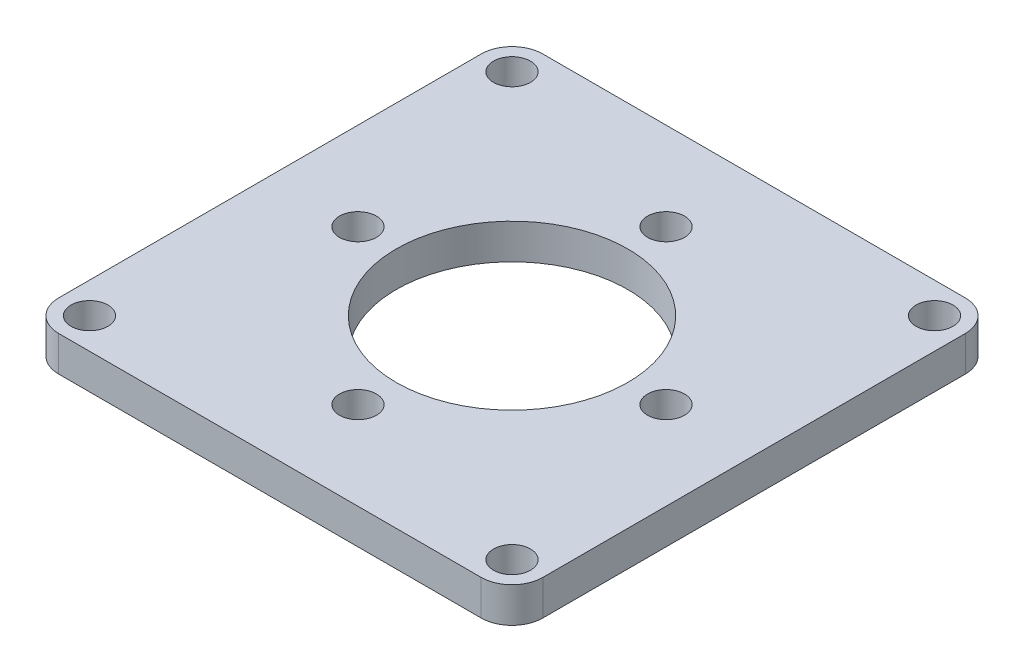
ISO-10303-21;
HEADER;
FILE_DESCRIPTION(('STEP AP214'),'2;1');
FILE_NAME('part.step','',(''),(''),'','','');
FILE_SCHEMA(('AUTOMOTIVE_DESIGN { 1 0 10303 214 1 1 1 1 }'));
ENDSEC;
DATA;
#1=APPLICATION_CONTEXT('core data for automotive mechanical design processes');
#2=APPLICATION_PROTOCOL_DEFINITION('international standard','automotive_design',2000,#1);
#3=PRODUCT_CONTEXT('',#1,'mechanical');
#4=PRODUCT('Part','Part','',(#3));
#5=PRODUCT_RELATED_PRODUCT_CATEGORY('part','',(#4));
#6=PRODUCT_DEFINITION_FORMATION('','',#4);
#7=PRODUCT_DEFINITION_CONTEXT('part definition',#1,'design');
#8=PRODUCT_DEFINITION('design','',#6,#7);
#9=PRODUCT_DEFINITION_SHAPE('','',#8);
#10=(LENGTH_UNIT() NAMED_UNIT(*) SI_UNIT(.MILLI.,.METRE.));
#11=(NAMED_UNIT(*) PLANE_ANGLE_UNIT() SI_UNIT($,.RADIAN.));
#12=(NAMED_UNIT(*) SI_UNIT($,.STERADIAN.) SOLID_ANGLE_UNIT());
#13=UNCERTAINTY_MEASURE_WITH_UNIT(LENGTH_MEASURE(1.E-05),#10,'distance_accuracy_value','');
#14=(GEOMETRIC_REPRESENTATION_CONTEXT(3) GLOBAL_UNCERTAINTY_ASSIGNED_CONTEXT((#13)) GLOBAL_UNIT_ASSIGNED_CONTEXT((#10,
#11,#12)) REPRESENTATION_CONTEXT('',''));
#15=CARTESIAN_POINT('',(0.,0.,0.));
#16=DIRECTION('',(0.,0.,1.));
#17=DIRECTION('',(1.,0.,0.));
#18=AXIS2_PLACEMENT_3D('',#15,#16,#17);
#19=CARTESIAN_POINT('',(27.5,4.,27.5));
#20=DIRECTION('',(-1.,0.,0.));
#21=DIRECTION('',(0.,0.,1.));
#22=AXIS2_PLACEMENT_3D('',#19,#20,#21);
#23=PLANE('',#22);
#24=DIRECTION('',(0.,0.,-1.));
#25=VECTOR('',#24,1.);
#26=CARTESIAN_POINT('',(27.5,0.,27.5));
#27=LINE('',#26,#25);
#28=CARTESIAN_POINT('',(27.5,0.,24.));
#29=VERTEX_POINT('',#28);
#30=CARTESIAN_POINT('',(27.5,0.,-24.));
#31=VERTEX_POINT('',#30);
#32=EDGE_CURVE('E129',#29,#31,#27,.T.);
#33=ORIENTED_EDGE('',*,*,#32,.T.);
#34=DIRECTION('',(0.,-1.,0.));
#35=VECTOR('',#34,1.);
#36=CARTESIAN_POINT('',(27.5,4.,-24.));
#37=LINE('',#36,#35);
#38=CARTESIAN_POINT('',(27.5,4.,-24.));
#39=VERTEX_POINT('',#38);
#40=EDGE_CURVE('E152',#31,#39,#37,.F.);
#41=ORIENTED_EDGE('',*,*,#40,.T.);
#42=DIRECTION('',(0.,0.,-1.));
#43=VECTOR('',#42,1.);
#44=CARTESIAN_POINT('',(27.5,4.,27.5));
#45=LINE('',#44,#43);
#46=CARTESIAN_POINT('',(27.5,4.,24.));
#47=VERTEX_POINT('',#46);
#48=EDGE_CURVE('E127',#47,#39,#45,.T.);
#49=ORIENTED_EDGE('',*,*,#48,.F.);
#50=DIRECTION('',(0.,-1.,0.));
#51=VECTOR('',#50,1.);
#52=CARTESIAN_POINT('',(27.5,4.,24.));
#53=LINE('',#52,#51);
#54=EDGE_CURVE('E149',#47,#29,#53,.T.);
#55=ORIENTED_EDGE('',*,*,#54,.T.);
#56=EDGE_LOOP('',(#33,#41,#49,#55));
#57=FACE_BOUND('',#56,.T.);
#58=ADVANCED_FACE('F34',(#57),#23,.F.);
#59=CARTESIAN_POINT('',(-27.5,4.,-27.5));
#60=DIRECTION('',(0.,0.,1.));
#61=DIRECTION('',(1.,0.,0.));
#62=AXIS2_PLACEMENT_3D('',#59,#60,#61);
#63=PLANE('',#62);
#64=DIRECTION('',(-1.,0.,0.));
#65=VECTOR('',#64,1.);
#66=CARTESIAN_POINT('',(-27.5,0.,-27.5));
#67=LINE('',#66,#65);
#68=CARTESIAN_POINT('',(24.,0.,-27.5));
#69=VERTEX_POINT('',#68);
#70=CARTESIAN_POINT('',(-24.,0.,-27.5));
#71=VERTEX_POINT('',#70);
#72=EDGE_CURVE('E125',#69,#71,#67,.T.);
#73=ORIENTED_EDGE('',*,*,#72,.T.);
#74=DIRECTION('',(0.,-1.,0.));
#75=VECTOR('',#74,1.);
#76=CARTESIAN_POINT('',(-24.,4.,-27.5));
#77=LINE('',#76,#75);
#78=CARTESIAN_POINT('',(-24.,4.,-27.5));
#79=VERTEX_POINT('',#78);
#80=EDGE_CURVE('E104',#71,#79,#77,.F.);
#81=ORIENTED_EDGE('',*,*,#80,.T.);
#82=DIRECTION('',(-1.,0.,0.));
#83=VECTOR('',#82,1.);
#84=CARTESIAN_POINT('',(-27.5,4.,-27.5));
#85=LINE('',#84,#83);
#86=CARTESIAN_POINT('',(24.,4.,-27.5));
#87=VERTEX_POINT('',#86);
#88=EDGE_CURVE('E168',#87,#79,#85,.T.);
#89=ORIENTED_EDGE('',*,*,#88,.F.);
#90=DIRECTION('',(0.,-1.,0.));
#91=VECTOR('',#90,1.);
#92=CARTESIAN_POINT('',(24.,4.,-27.5));
#93=LINE('',#92,#91);
#94=EDGE_CURVE('E109',#87,#69,#93,.T.);
#95=ORIENTED_EDGE('',*,*,#94,.T.);
#96=EDGE_LOOP('',(#73,#81,#89,#95));
#97=FACE_BOUND('',#96,.T.);
#98=ADVANCED_FACE('F263',(#97),#63,.F.);
#99=CARTESIAN_POINT('',(-27.5,4.,27.5));
#100=DIRECTION('',(1.,0.,0.));
#101=DIRECTION('',(0.,0.,-1.));
#102=AXIS2_PLACEMENT_3D('',#99,#100,#101);
#103=PLANE('',#102);
#104=DIRECTION('',(0.,0.,1.));
#105=VECTOR('',#104,1.);
#106=CARTESIAN_POINT('',(-27.5,4.,27.5));
#107=LINE('',#106,#105);
#108=CARTESIAN_POINT('',(-27.5,4.,-24.));
#109=VERTEX_POINT('',#108);
#110=CARTESIAN_POINT('',(-27.5,4.,24.));
#111=VERTEX_POINT('',#110);
#112=EDGE_CURVE('E118',#109,#111,#107,.T.);
#113=ORIENTED_EDGE('',*,*,#112,.F.);
#114=DIRECTION('',(0.,-1.,0.));
#115=VECTOR('',#114,1.);
#116=CARTESIAN_POINT('',(-27.5,4.,-24.));
#117=LINE('',#116,#115);
#118=CARTESIAN_POINT('',(-27.5,0.,-24.));
#119=VERTEX_POINT('',#118);
#120=EDGE_CURVE('E103',#109,#119,#117,.T.);
#121=ORIENTED_EDGE('',*,*,#120,.T.);
#122=DIRECTION('',(0.,0.,1.));
#123=VECTOR('',#122,1.);
#124=CARTESIAN_POINT('',(-27.5,0.,27.5));
#125=LINE('',#124,#123);
#126=CARTESIAN_POINT('',(-27.5,0.,24.));
#127=VERTEX_POINT('',#126);
#128=EDGE_CURVE('E116',#119,#127,#125,.T.);
#129=ORIENTED_EDGE('',*,*,#128,.T.);
#130=DIRECTION('',(0.,-1.,0.));
#131=VECTOR('',#130,1.);
#132=CARTESIAN_POINT('',(-27.5,4.,24.));
#133=LINE('',#132,#131);
#134=EDGE_CURVE('E120',#127,#111,#133,.F.);
#135=ORIENTED_EDGE('',*,*,#134,.T.);
#136=EDGE_LOOP('',(#113,#121,#129,#135));
#137=FACE_BOUND('',#136,.T.);
#138=ADVANCED_FACE('F115',(#137),#103,.F.);
#139=CARTESIAN_POINT('',(-27.5,4.,27.5));
#140=DIRECTION('',(0.,0.,-1.));
#141=DIRECTION('',(-1.,0.,0.));
#142=AXIS2_PLACEMENT_3D('',#139,#140,#141);
#143=PLANE('',#142);
#144=DIRECTION('',(1.,0.,0.));
#145=VECTOR('',#144,1.);
#146=CARTESIAN_POINT('',(-27.5,0.,27.5));
#147=LINE('',#146,#145);
#148=CARTESIAN_POINT('',(-24.,0.,27.5));
#149=VERTEX_POINT('',#148);
#150=CARTESIAN_POINT('',(24.,0.,27.5));
#151=VERTEX_POINT('',#150);
#152=EDGE_CURVE('E124',#149,#151,#147,.T.);
#153=ORIENTED_EDGE('',*,*,#152,.T.);
#154=DIRECTION('',(0.,-1.,0.));
#155=VECTOR('',#154,1.);
#156=CARTESIAN_POINT('',(24.,4.,27.5));
#157=LINE('',#156,#155);
#158=CARTESIAN_POINT('',(24.,4.,27.5));
#159=VERTEX_POINT('',#158);
#160=EDGE_CURVE('E11',#151,#159,#157,.F.);
#161=ORIENTED_EDGE('',*,*,#160,.T.);
#162=DIRECTION('',(1.,0.,0.));
#163=VECTOR('',#162,1.);
#164=CARTESIAN_POINT('',(-27.5,4.,27.5));
#165=LINE('',#164,#163);
#166=CARTESIAN_POINT('',(-24.,4.,27.5));
#167=VERTEX_POINT('',#166);
#168=EDGE_CURVE('E133',#167,#159,#165,.T.);
#169=ORIENTED_EDGE('',*,*,#168,.F.);
#170=DIRECTION('',(0.,-1.,0.));
#171=VECTOR('',#170,1.);
#172=CARTESIAN_POINT('',(-24.,4.,27.5));
#173=LINE('',#172,#171);
#174=EDGE_CURVE('E42',#167,#149,#173,.T.);
#175=ORIENTED_EDGE('',*,*,#174,.T.);
#176=EDGE_LOOP('',(#153,#161,#169,#175));
#177=FACE_BOUND('',#176,.T.);
#178=ADVANCED_FACE('F155',(#177),#143,.F.);
#179=CARTESIAN_POINT('',(0.,4.,0.));
#180=DIRECTION('',(0.,-1.,0.));
#181=DIRECTION('',(0.,0.,-1.));
#182=AXIS2_PLACEMENT_3D('',#179,#180,#181);
#183=PLANE('',#182);
#184=CARTESIAN_POINT('',(-23.9999999999999,4.,24.0000000000001));
#185=DIRECTION('',(0.,1.,0.));
#186=DIRECTION('',(1.,0.,0.));
#187=AXIS2_PLACEMENT_3D('',#184,#185,#186);
#188=CIRCLE('',#187,2.1);
#189=CARTESIAN_POINT('',(-21.8999999999999,4.,24.0000000000001));
#190=VERTEX_POINT('',#189);
#191=EDGE_CURVE('E226',#190,#190,#188,.T.);
#192=ORIENTED_EDGE('',*,*,#191,.F.);
#193=EDGE_LOOP('',(#192));
#194=FACE_BOUND('',#193,.T.);
#195=CARTESIAN_POINT('',(24.,4.,24.));
#196=DIRECTION('',(0.,1.,0.));
#197=DIRECTION('',(0.,0.,-1.));
#198=AXIS2_PLACEMENT_3D('',#195,#196,#197);
#199=CIRCLE('',#198,2.1);
#200=CARTESIAN_POINT('',(24.,4.,21.9));
#201=VERTEX_POINT('',#200);
#202=EDGE_CURVE('E220',#201,#201,#199,.T.);
#203=ORIENTED_EDGE('',*,*,#202,.F.);
#204=EDGE_LOOP('',(#203));
#205=FACE_BOUND('',#204,.T.);
#206=CARTESIAN_POINT('',(23.9999999999998,4.,-24.0000000000003));
#207=DIRECTION('',(0.,1.,0.));
#208=DIRECTION('',(-1.,0.,0.));
#209=AXIS2_PLACEMENT_3D('',#206,#207,#208);
#210=CIRCLE('',#209,2.1);
#211=CARTESIAN_POINT('',(21.8999999999998,4.,-24.0000000000002));
#212=VERTEX_POINT('',#211);
#213=EDGE_CURVE('E214',#212,#212,#210,.T.);
#214=ORIENTED_EDGE('',*,*,#213,.F.);
#215=EDGE_LOOP('',(#214));
#216=FACE_BOUND('',#215,.T.);
#217=CARTESIAN_POINT('',(-24.,4.,-24.));
#218=DIRECTION('',(0.,1.,0.));
#219=DIRECTION('',(0.,0.,1.));
#220=AXIS2_PLACEMENT_3D('',#217,#218,#219);
#221=CIRCLE('',#220,2.1);
#222=CARTESIAN_POINT('',(-24.,4.,-21.9));
#223=VERTEX_POINT('',#222);
#224=EDGE_CURVE('E208',#223,#223,#221,.T.);
#225=ORIENTED_EDGE('',*,*,#224,.F.);
#226=EDGE_LOOP('',(#225));
#227=FACE_BOUND('',#226,.T.);
#228=CARTESIAN_POINT('',(17.5,4.,1.2220184685951E-13));
#229=DIRECTION('',(0.,1.,0.));
#230=DIRECTION('',(-1.,0.,0.));
#231=AXIS2_PLACEMENT_3D('',#228,#229,#230);
#232=CIRCLE('',#231,2.1);
#233=CARTESIAN_POINT('',(15.4,4.,1.14869736047939E-13));
#234=VERTEX_POINT('',#233);
#235=EDGE_CURVE('E203',#234,#234,#232,.T.);
#236=ORIENTED_EDGE('',*,*,#235,.F.);
#237=EDGE_LOOP('',(#236));
#238=FACE_BOUND('',#237,.T.);
#239=CARTESIAN_POINT('',(0.,4.,17.5));
#240=DIRECTION('',(0.,1.,0.));
#241=DIRECTION('',(0.,0.,-1.));
#242=AXIS2_PLACEMENT_3D('',#239,#240,#241);
#243=CIRCLE('',#242,2.1);
#244=CARTESIAN_POINT('',(0.,4.,15.4));
#245=VERTEX_POINT('',#244);
#246=EDGE_CURVE('E197',#245,#245,#243,.T.);
#247=ORIENTED_EDGE('',*,*,#246,.F.);
#248=EDGE_LOOP('',(#247));
#249=FACE_BOUND('',#248,.T.);
#250=CARTESIAN_POINT('',(-17.5,4.,-2.44403693719019E-13));
#251=DIRECTION('',(0.,1.,0.));
#252=DIRECTION('',(1.,0.,0.));
#253=AXIS2_PLACEMENT_3D('',#250,#251,#252);
#254=CIRCLE('',#253,2.1);
#255=CARTESIAN_POINT('',(-15.4,4.,-2.22407361284308E-13));
#256=VERTEX_POINT('',#255);
#257=EDGE_CURVE('E190',#256,#256,#254,.T.);
#258=ORIENTED_EDGE('',*,*,#257,.F.);
#259=EDGE_LOOP('',(#258));
#260=FACE_BOUND('',#259,.T.);
#261=CARTESIAN_POINT('',(0.,4.,-17.5));
#262=DIRECTION('',(0.,1.,0.));
#263=DIRECTION('',(0.,0.,1.));
#264=AXIS2_PLACEMENT_3D('',#261,#262,#263);
#265=CIRCLE('',#264,2.1);
#266=CARTESIAN_POINT('',(0.,4.,-15.4));
#267=VERTEX_POINT('',#266);
#268=EDGE_CURVE('E184',#267,#267,#265,.T.);
#269=ORIENTED_EDGE('',*,*,#268,.F.);
#270=EDGE_LOOP('',(#269));
#271=FACE_BOUND('',#270,.T.);
#272=CARTESIAN_POINT('',(0.,4.,0.));
#273=DIRECTION('',(0.,1.,0.));
#274=DIRECTION('',(0.,0.,1.));
#275=AXIS2_PLACEMENT_3D('',#272,#273,#274);
#276=CIRCLE('',#275,13.15);
#277=CARTESIAN_POINT('',(0.,4.,13.15));
#278=VERTEX_POINT('',#277);
#279=EDGE_CURVE('E173',#278,#278,#276,.T.);
#280=ORIENTED_EDGE('',*,*,#279,.F.);
#281=EDGE_LOOP('',(#280));
#282=FACE_BOUND('',#281,.T.);
#283=ORIENTED_EDGE('',*,*,#88,.T.);
#284=CARTESIAN_POINT('',(-24.,4.,-24.));
#285=DIRECTION('',(0.,-1.,0.));
#286=DIRECTION('',(0.,0.,-1.));
#287=AXIS2_PLACEMENT_3D('',#284,#285,#286);
#288=CIRCLE('',#287,3.5);
#289=EDGE_CURVE('E147',#79,#109,#288,.F.);
#290=ORIENTED_EDGE('',*,*,#289,.T.);
#291=ORIENTED_EDGE('',*,*,#112,.T.);
#292=CARTESIAN_POINT('',(-24.,4.,24.));
#293=DIRECTION('',(0.,-1.,0.));
#294=DIRECTION('',(0.,0.,-1.));
#295=AXIS2_PLACEMENT_3D('',#292,#293,#294);
#296=CIRCLE('',#295,3.5);
#297=EDGE_CURVE('E54',#111,#167,#296,.F.);
#298=ORIENTED_EDGE('',*,*,#297,.T.);
#299=ORIENTED_EDGE('',*,*,#168,.T.);
#300=CARTESIAN_POINT('',(24.,4.,24.));
#301=DIRECTION('',(0.,-1.,0.));
#302=DIRECTION('',(0.,0.,-1.));
#303=AXIS2_PLACEMENT_3D('',#300,#301,#302);
#304=CIRCLE('',#303,3.5);
#305=EDGE_CURVE('E143',#159,#47,#304,.F.);
#306=ORIENTED_EDGE('',*,*,#305,.T.);
#307=ORIENTED_EDGE('',*,*,#48,.T.);
#308=CARTESIAN_POINT('',(24.,4.,-24.));
#309=DIRECTION('',(0.,-1.,0.));
#310=DIRECTION('',(0.,0.,-1.));
#311=AXIS2_PLACEMENT_3D('',#308,#309,#310);
#312=CIRCLE('',#311,3.5);
#313=EDGE_CURVE('E145',#39,#87,#312,.F.);
#314=ORIENTED_EDGE('',*,*,#313,.T.);
#315=EDGE_LOOP('',(#283,#290,#291,#298,#299,#306,#307,#314));
#316=FACE_BOUND('',#315,.T.);
#317=ADVANCED_FACE('F241',(#194,#205,#216,#227,#238,#249,#260,#271,#282,#316),#183,.F.);
#318=CARTESIAN_POINT('',(0.,0.,0.));
#319=DIRECTION('',(0.,-1.,0.));
#320=DIRECTION('',(0.,0.,-1.));
#321=AXIS2_PLACEMENT_3D('',#318,#319,#320);
#322=PLANE('',#321);
#323=CARTESIAN_POINT('',(-23.9999999999999,0.,24.0000000000001));
#324=DIRECTION('',(0.,1.,0.));
#325=DIRECTION('',(1.,0.,0.));
#326=AXIS2_PLACEMENT_3D('',#323,#324,#325);
#327=CIRCLE('',#326,2.1);
#328=CARTESIAN_POINT('',(-21.8999999999999,0.,24.0000000000001));
#329=VERTEX_POINT('',#328);
#330=EDGE_CURVE('E211',#329,#329,#327,.T.);
#331=ORIENTED_EDGE('',*,*,#330,.T.);
#332=EDGE_LOOP('',(#331));
#333=FACE_BOUND('',#332,.T.);
#334=CARTESIAN_POINT('',(24.,0.,24.));
#335=DIRECTION('',(0.,1.,0.));
#336=DIRECTION('',(0.,0.,-1.));
#337=AXIS2_PLACEMENT_3D('',#334,#335,#336);
#338=CIRCLE('',#337,2.1);
#339=CARTESIAN_POINT('',(24.,0.,21.9));
#340=VERTEX_POINT('',#339);
#341=EDGE_CURVE('E223',#340,#340,#338,.T.);
#342=ORIENTED_EDGE('',*,*,#341,.T.);
#343=EDGE_LOOP('',(#342));
#344=FACE_BOUND('',#343,.T.);
#345=CARTESIAN_POINT('',(23.9999999999998,0.,-24.0000000000003));
#346=DIRECTION('',(0.,1.,0.));
#347=DIRECTION('',(-1.,0.,0.));
#348=AXIS2_PLACEMENT_3D('',#345,#346,#347);
#349=CIRCLE('',#348,2.1);
#350=CARTESIAN_POINT('',(21.8999999999998,0.,-24.0000000000002));
#351=VERTEX_POINT('',#350);
#352=EDGE_CURVE('E217',#351,#351,#349,.T.);
#353=ORIENTED_EDGE('',*,*,#352,.T.);
#354=EDGE_LOOP('',(#353));
#355=FACE_BOUND('',#354,.T.);
#356=CARTESIAN_POINT('',(-24.,0.,-24.));
#357=DIRECTION('',(0.,1.,0.));
#358=DIRECTION('',(0.,0.,1.));
#359=AXIS2_PLACEMENT_3D('',#356,#357,#358);
#360=CIRCLE('',#359,2.1);
#361=CARTESIAN_POINT('',(-24.,0.,-21.9));
#362=VERTEX_POINT('',#361);
#363=EDGE_CURVE('E194',#362,#362,#360,.T.);
#364=ORIENTED_EDGE('',*,*,#363,.T.);
#365=EDGE_LOOP('',(#364));
#366=FACE_BOUND('',#365,.T.);
#367=CARTESIAN_POINT('',(17.5,0.,1.2220184685951E-13));
#368=DIRECTION('',(0.,1.,0.));
#369=DIRECTION('',(-1.,0.,0.));
#370=AXIS2_PLACEMENT_3D('',#367,#368,#369);
#371=CIRCLE('',#370,2.1);
#372=CARTESIAN_POINT('',(15.4,0.,1.14869736047939E-13));
#373=VERTEX_POINT('',#372);
#374=EDGE_CURVE('E187',#373,#373,#371,.T.);
#375=ORIENTED_EDGE('',*,*,#374,.T.);
#376=EDGE_LOOP('',(#375));
#377=FACE_BOUND('',#376,.T.);
#378=CARTESIAN_POINT('',(0.,0.,17.5));
#379=DIRECTION('',(0.,1.,0.));
#380=DIRECTION('',(0.,0.,-1.));
#381=AXIS2_PLACEMENT_3D('',#378,#379,#380);
#382=CIRCLE('',#381,2.1);
#383=CARTESIAN_POINT('',(0.,0.,15.4));
#384=VERTEX_POINT('',#383);
#385=EDGE_CURVE('E200',#384,#384,#382,.T.);
#386=ORIENTED_EDGE('',*,*,#385,.T.);
#387=EDGE_LOOP('',(#386));
#388=FACE_BOUND('',#387,.T.);
#389=CARTESIAN_POINT('',(-17.5,0.,-2.44403693719019E-13));
#390=DIRECTION('',(0.,1.,0.));
#391=DIRECTION('',(1.,0.,0.));
#392=AXIS2_PLACEMENT_3D('',#389,#390,#391);
#393=CIRCLE('',#392,2.1);
#394=CARTESIAN_POINT('',(-15.4,0.,-2.22407361284308E-13));
#395=VERTEX_POINT('',#394);
#396=EDGE_CURVE('E193',#395,#395,#393,.T.);
#397=ORIENTED_EDGE('',*,*,#396,.T.);
#398=EDGE_LOOP('',(#397));
#399=FACE_BOUND('',#398,.T.);
#400=CARTESIAN_POINT('',(0.,0.,-17.5));
#401=DIRECTION('',(0.,1.,0.));
#402=DIRECTION('',(0.,0.,1.));
#403=AXIS2_PLACEMENT_3D('',#400,#401,#402);
#404=CIRCLE('',#403,2.1);
#405=CARTESIAN_POINT('',(0.,0.,-15.4));
#406=VERTEX_POINT('',#405);
#407=EDGE_CURVE('E182',#406,#406,#404,.T.);
#408=ORIENTED_EDGE('',*,*,#407,.T.);
#409=EDGE_LOOP('',(#408));
#410=FACE_BOUND('',#409,.T.);
#411=CARTESIAN_POINT('',(0.,0.,0.));
#412=DIRECTION('',(0.,1.,0.));
#413=DIRECTION('',(0.,0.,1.));
#414=AXIS2_PLACEMENT_3D('',#411,#412,#413);
#415=CIRCLE('',#414,13.15);
#416=CARTESIAN_POINT('',(0.,0.,13.15));
#417=VERTEX_POINT('',#416);
#418=EDGE_CURVE('E177',#417,#417,#415,.T.);
#419=ORIENTED_EDGE('',*,*,#418,.T.);
#420=EDGE_LOOP('',(#419));
#421=FACE_BOUND('',#420,.T.);
#422=ORIENTED_EDGE('',*,*,#128,.F.);
#423=CARTESIAN_POINT('',(-24.,0.,-24.));
#424=DIRECTION('',(0.,-1.,0.));
#425=DIRECTION('',(0.,0.,-1.));
#426=AXIS2_PLACEMENT_3D('',#423,#424,#425);
#427=CIRCLE('',#426,3.5);
#428=EDGE_CURVE('E99',#119,#71,#427,.T.);
#429=ORIENTED_EDGE('',*,*,#428,.T.);
#430=ORIENTED_EDGE('',*,*,#72,.F.);
#431=CARTESIAN_POINT('',(24.,0.,-24.));
#432=DIRECTION('',(0.,-1.,0.));
#433=DIRECTION('',(0.,0.,-1.));
#434=AXIS2_PLACEMENT_3D('',#431,#432,#433);
#435=CIRCLE('',#434,3.5);
#436=EDGE_CURVE('E110',#69,#31,#435,.T.);
#437=ORIENTED_EDGE('',*,*,#436,.T.);
#438=ORIENTED_EDGE('',*,*,#32,.F.);
#439=CARTESIAN_POINT('',(24.,0.,24.));
#440=DIRECTION('',(0.,-1.,0.));
#441=DIRECTION('',(0.,0.,-1.));
#442=AXIS2_PLACEMENT_3D('',#439,#440,#441);
#443=CIRCLE('',#442,3.5);
#444=EDGE_CURVE('E136',#29,#151,#443,.T.);
#445=ORIENTED_EDGE('',*,*,#444,.T.);
#446=ORIENTED_EDGE('',*,*,#152,.F.);
#447=CARTESIAN_POINT('',(-24.,0.,24.));
#448=DIRECTION('',(0.,-1.,0.));
#449=DIRECTION('',(0.,0.,-1.));
#450=AXIS2_PLACEMENT_3D('',#447,#448,#449);
#451=CIRCLE('',#450,3.5);
#452=EDGE_CURVE('E119',#149,#127,#451,.T.);
#453=ORIENTED_EDGE('',*,*,#452,.T.);
#454=EDGE_LOOP('',(#422,#429,#430,#437,#438,#445,#446,#453));
#455=FACE_BOUND('',#454,.T.);
#456=ADVANCED_FACE('F122',(#333,#344,#355,#366,#377,#388,#399,#410,#421,#455),#322,.T.);
#457=CARTESIAN_POINT('',(-24.,4.,-24.));
#458=DIRECTION('',(0.,-1.,0.));
#459=DIRECTION('',(0.,0.,-1.));
#460=AXIS2_PLACEMENT_3D('',#457,#458,#459);
#461=CYLINDRICAL_SURFACE('',#460,3.5);
#462=ORIENTED_EDGE('',*,*,#289,.F.);
#463=ORIENTED_EDGE('',*,*,#80,.F.);
#464=ORIENTED_EDGE('',*,*,#428,.F.);
#465=ORIENTED_EDGE('',*,*,#120,.F.);
#466=EDGE_LOOP('',(#462,#463,#464,#465));
#467=FACE_BOUND('',#466,.T.);
#468=ADVANCED_FACE('F102',(#467),#461,.T.);
#469=CARTESIAN_POINT('',(24.,4.,-24.));
#470=DIRECTION('',(0.,-1.,0.));
#471=DIRECTION('',(0.,0.,-1.));
#472=AXIS2_PLACEMENT_3D('',#469,#470,#471);
#473=CYLINDRICAL_SURFACE('',#472,3.5);
#474=ORIENTED_EDGE('',*,*,#313,.F.);
#475=ORIENTED_EDGE('',*,*,#40,.F.);
#476=ORIENTED_EDGE('',*,*,#436,.F.);
#477=ORIENTED_EDGE('',*,*,#94,.F.);
#478=EDGE_LOOP('',(#474,#475,#476,#477));
#479=FACE_BOUND('',#478,.T.);
#480=ADVANCED_FACE('F265',(#479),#473,.T.);
#481=CARTESIAN_POINT('',(24.,4.,24.));
#482=DIRECTION('',(0.,-1.,0.));
#483=DIRECTION('',(0.,0.,-1.));
#484=AXIS2_PLACEMENT_3D('',#481,#482,#483);
#485=CYLINDRICAL_SURFACE('',#484,3.5);
#486=ORIENTED_EDGE('',*,*,#305,.F.);
#487=ORIENTED_EDGE('',*,*,#160,.F.);
#488=ORIENTED_EDGE('',*,*,#444,.F.);
#489=ORIENTED_EDGE('',*,*,#54,.F.);
#490=EDGE_LOOP('',(#486,#487,#488,#489));
#491=FACE_BOUND('',#490,.T.);
#492=ADVANCED_FACE('F162',(#491),#485,.T.);
#493=CARTESIAN_POINT('',(-24.,4.,24.));
#494=DIRECTION('',(0.,-1.,0.));
#495=DIRECTION('',(0.,0.,-1.));
#496=AXIS2_PLACEMENT_3D('',#493,#494,#495);
#497=CYLINDRICAL_SURFACE('',#496,3.5);
#498=ORIENTED_EDGE('',*,*,#297,.F.);
#499=ORIENTED_EDGE('',*,*,#134,.F.);
#500=ORIENTED_EDGE('',*,*,#452,.F.);
#501=ORIENTED_EDGE('',*,*,#174,.F.);
#502=EDGE_LOOP('',(#498,#499,#500,#501));
#503=FACE_BOUND('',#502,.T.);
#504=ADVANCED_FACE('F36',(#503),#497,.T.);
#505=CARTESIAN_POINT('',(0.,0.,0.));
#506=DIRECTION('',(0.,1.,0.));
#507=DIRECTION('',(0.,0.,1.));
#508=AXIS2_PLACEMENT_3D('',#505,#506,#507);
#509=CYLINDRICAL_SURFACE('',#508,13.15);
#510=ORIENTED_EDGE('',*,*,#418,.F.);
#511=EDGE_LOOP('',(#510));
#512=FACE_BOUND('',#511,.T.);
#513=ORIENTED_EDGE('',*,*,#279,.T.);
#514=EDGE_LOOP('',(#513));
#515=FACE_BOUND('',#514,.T.);
#516=ADVANCED_FACE('F286',(#512,#515),#509,.F.);
#517=CARTESIAN_POINT('',(0.,0.,-17.5));
#518=DIRECTION('',(0.,1.,0.));
#519=DIRECTION('',(0.,0.,1.));
#520=AXIS2_PLACEMENT_3D('',#517,#518,#519);
#521=CYLINDRICAL_SURFACE('',#520,2.1);
#522=ORIENTED_EDGE('',*,*,#407,.F.);
#523=EDGE_LOOP('',(#522));
#524=FACE_BOUND('',#523,.T.);
#525=ORIENTED_EDGE('',*,*,#268,.T.);
#526=EDGE_LOOP('',(#525));
#527=FACE_BOUND('',#526,.T.);
#528=ADVANCED_FACE('F289',(#524,#527),#521,.F.);
#529=CARTESIAN_POINT('',(-17.5,0.,-2.44403693719019E-13));
#530=DIRECTION('',(0.,1.,0.));
#531=DIRECTION('',(0.,0.,1.));
#532=AXIS2_PLACEMENT_3D('',#529,#530,#531);
#533=CYLINDRICAL_SURFACE('',#532,2.1);
#534=ORIENTED_EDGE('',*,*,#396,.F.);
#535=EDGE_LOOP('',(#534));
#536=FACE_BOUND('',#535,.T.);
#537=ORIENTED_EDGE('',*,*,#257,.T.);
#538=EDGE_LOOP('',(#537));
#539=FACE_BOUND('',#538,.T.);
#540=ADVANCED_FACE('F293',(#536,#539),#533,.F.);
#541=CARTESIAN_POINT('',(0.,0.,17.5));
#542=DIRECTION('',(0.,1.,0.));
#543=DIRECTION('',(0.,0.,1.));
#544=AXIS2_PLACEMENT_3D('',#541,#542,#543);
#545=CYLINDRICAL_SURFACE('',#544,2.1);
#546=ORIENTED_EDGE('',*,*,#385,.F.);
#547=EDGE_LOOP('',(#546));
#548=FACE_BOUND('',#547,.T.);
#549=ORIENTED_EDGE('',*,*,#246,.T.);
#550=EDGE_LOOP('',(#549));
#551=FACE_BOUND('',#550,.T.);
#552=ADVANCED_FACE('F297',(#548,#551),#545,.F.);
#553=CARTESIAN_POINT('',(17.5,0.,1.2220184685951E-13));
#554=DIRECTION('',(0.,1.,0.));
#555=DIRECTION('',(0.,0.,1.));
#556=AXIS2_PLACEMENT_3D('',#553,#554,#555);
#557=CYLINDRICAL_SURFACE('',#556,2.1);
#558=ORIENTED_EDGE('',*,*,#374,.F.);
#559=EDGE_LOOP('',(#558));
#560=FACE_BOUND('',#559,.T.);
#561=ORIENTED_EDGE('',*,*,#235,.T.);
#562=EDGE_LOOP('',(#561));
#563=FACE_BOUND('',#562,.T.);
#564=ADVANCED_FACE('F301',(#560,#563),#557,.F.);
#565=CARTESIAN_POINT('',(-24.,0.,-24.));
#566=DIRECTION('',(0.,1.,0.));
#567=DIRECTION('',(0.,0.,1.));
#568=AXIS2_PLACEMENT_3D('',#565,#566,#567);
#569=CYLINDRICAL_SURFACE('',#568,2.1);
#570=ORIENTED_EDGE('',*,*,#363,.F.);
#571=EDGE_LOOP('',(#570));
#572=FACE_BOUND('',#571,.T.);
#573=ORIENTED_EDGE('',*,*,#224,.T.);
#574=EDGE_LOOP('',(#573));
#575=FACE_BOUND('',#574,.T.);
#576=ADVANCED_FACE('F305',(#572,#575),#569,.F.);
#577=CARTESIAN_POINT('',(23.9999999999998,0.,-24.0000000000003));
#578=DIRECTION('',(0.,1.,0.));
#579=DIRECTION('',(0.,0.,1.));
#580=AXIS2_PLACEMENT_3D('',#577,#578,#579);
#581=CYLINDRICAL_SURFACE('',#580,2.1);
#582=ORIENTED_EDGE('',*,*,#352,.F.);
#583=EDGE_LOOP('',(#582));
#584=FACE_BOUND('',#583,.T.);
#585=ORIENTED_EDGE('',*,*,#213,.T.);
#586=EDGE_LOOP('',(#585));
#587=FACE_BOUND('',#586,.T.);
#588=ADVANCED_FACE('F309',(#584,#587),#581,.F.);
#589=CARTESIAN_POINT('',(24.,0.,24.));
#590=DIRECTION('',(0.,1.,0.));
#591=DIRECTION('',(0.,0.,1.));
#592=AXIS2_PLACEMENT_3D('',#589,#590,#591);
#593=CYLINDRICAL_SURFACE('',#592,2.1);
#594=ORIENTED_EDGE('',*,*,#341,.F.);
#595=EDGE_LOOP('',(#594));
#596=FACE_BOUND('',#595,.T.);
#597=ORIENTED_EDGE('',*,*,#202,.T.);
#598=EDGE_LOOP('',(#597));
#599=FACE_BOUND('',#598,.T.);
#600=ADVANCED_FACE('F237',(#596,#599),#593,.F.);
#601=CARTESIAN_POINT('',(-23.9999999999999,0.,24.0000000000001));
#602=DIRECTION('',(0.,1.,0.));
#603=DIRECTION('',(0.,0.,1.));
#604=AXIS2_PLACEMENT_3D('',#601,#602,#603);
#605=CYLINDRICAL_SURFACE('',#604,2.1);
#606=ORIENTED_EDGE('',*,*,#330,.F.);
#607=EDGE_LOOP('',(#606));
#608=FACE_BOUND('',#607,.T.);
#609=ORIENTED_EDGE('',*,*,#191,.T.);
#610=EDGE_LOOP('',(#609));
#611=FACE_BOUND('',#610,.T.);
#612=ADVANCED_FACE('F234',(#608,#611),#605,.F.);
#613=CLOSED_SHELL('',(#58,#98,#138,#178,#317,#456,#468,#480,#492,#504,#516,#528,#540,#552,#564,
#576,#588,#600,#612));
#614=MANIFOLD_SOLID_BREP('B2',#613);
#615=ADVANCED_BREP_SHAPE_REPRESENTATION('',(#18,#614),#14);
#616=SHAPE_DEFINITION_REPRESENTATION(#9,#615);
ENDSEC;
END-ISO-10303-21;
